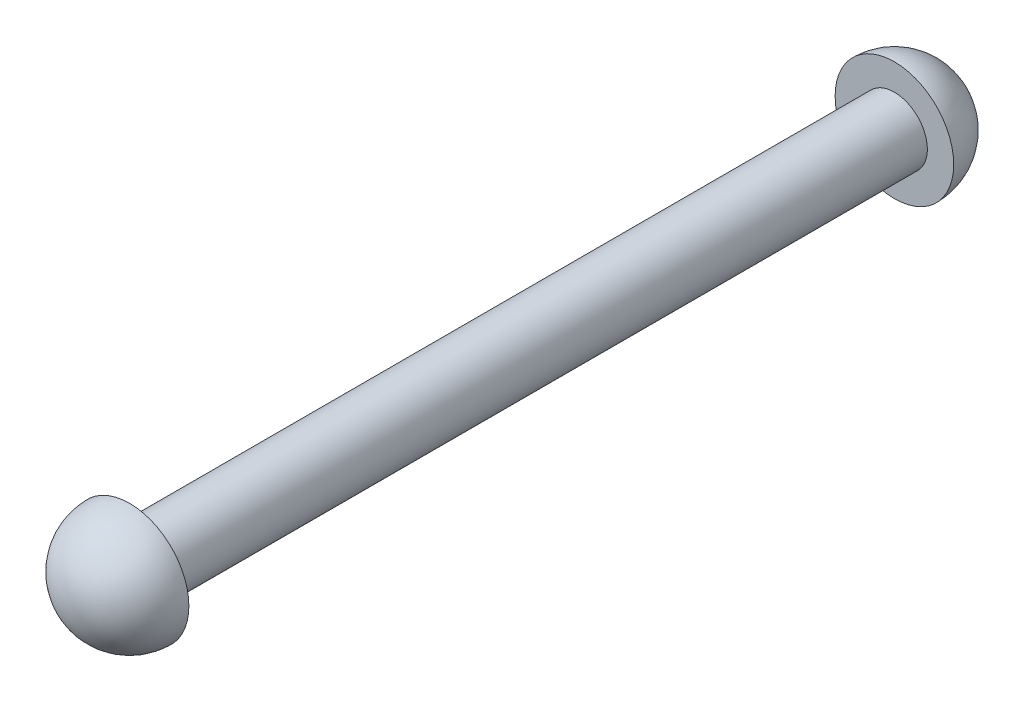
ISO-10303-21;
HEADER;
FILE_DESCRIPTION(('STEP AP214'),'2;1');
FILE_NAME('part.step','',(''),(''),'','','');
FILE_SCHEMA(('AUTOMOTIVE_DESIGN { 1 0 10303 214 1 1 1 1 }'));
ENDSEC;
DATA;
#1=APPLICATION_CONTEXT('core data for automotive mechanical design processes');
#2=APPLICATION_PROTOCOL_DEFINITION('international standard','automotive_design',2000,#1);
#3=PRODUCT_CONTEXT('',#1,'mechanical');
#4=PRODUCT('Part','Part','',(#3));
#5=PRODUCT_RELATED_PRODUCT_CATEGORY('part','',(#4));
#6=PRODUCT_DEFINITION_FORMATION('','',#4);
#7=PRODUCT_DEFINITION_CONTEXT('part definition',#1,'design');
#8=PRODUCT_DEFINITION('design','',#6,#7);
#9=PRODUCT_DEFINITION_SHAPE('','',#8);
#10=(LENGTH_UNIT() NAMED_UNIT(*) SI_UNIT(.MILLI.,.METRE.));
#11=(NAMED_UNIT(*) PLANE_ANGLE_UNIT() SI_UNIT($,.RADIAN.));
#12=(NAMED_UNIT(*) SI_UNIT($,.STERADIAN.) SOLID_ANGLE_UNIT());
#13=UNCERTAINTY_MEASURE_WITH_UNIT(LENGTH_MEASURE(1.E-05),#10,'distance_accuracy_value','');
#14=(GEOMETRIC_REPRESENTATION_CONTEXT(3) GLOBAL_UNCERTAINTY_ASSIGNED_CONTEXT((#13)) GLOBAL_UNIT_ASSIGNED_CONTEXT((#10,
#11,#12)) REPRESENTATION_CONTEXT('',''));
#15=CARTESIAN_POINT('',(0.,0.,0.));
#16=DIRECTION('',(0.,0.,1.));
#17=DIRECTION('',(1.,0.,0.));
#18=AXIS2_PLACEMENT_3D('',#15,#16,#17);
#19=CARTESIAN_POINT('',(0.,0.,42.5398199337912));
#20=DIRECTION('',(0.,0.,1.));
#21=DIRECTION('',(0.,-1.,0.));
#22=AXIS2_PLACEMENT_3D('',#19,#20,#21);
#23=CYLINDRICAL_SURFACE('',#22,3.175);
#24=CARTESIAN_POINT('',(0.,0.,-36.83));
#25=DIRECTION('',(0.,0.,1.));
#26=DIRECTION('',(0.,-1.,0.));
#27=AXIS2_PLACEMENT_3D('',#24,#25,#26);
#28=CIRCLE('',#27,3.175);
#29=CARTESIAN_POINT('',(0.,-3.175,-36.83));
#30=VERTEX_POINT('',#29);
#31=EDGE_CURVE('E62',#30,#30,#28,.T.);
#32=ORIENTED_EDGE('',*,*,#31,.T.);
#33=EDGE_LOOP('',(#32));
#34=FACE_BOUND('',#33,.T.);
#35=CARTESIAN_POINT('',(0.,0.,36.83));
#36=DIRECTION('',(0.,0.,1.));
#37=DIRECTION('',(0.,-1.,0.));
#38=AXIS2_PLACEMENT_3D('',#35,#36,#37);
#39=CIRCLE('',#38,3.175);
#40=CARTESIAN_POINT('',(0.,-3.175,36.83));
#41=VERTEX_POINT('',#40);
#42=EDGE_CURVE('E10',#41,#41,#39,.T.);
#43=ORIENTED_EDGE('',*,*,#42,.F.);
#44=EDGE_LOOP('',(#43));
#45=FACE_BOUND('',#44,.T.);
#46=ADVANCED_FACE('F45',(#34,#45),#23,.T.);
#47=CARTESIAN_POINT('',(0.,0.,36.83));
#48=DIRECTION('',(0.,0.,1.));
#49=DIRECTION('',(0.,-1.,0.));
#50=AXIS2_PLACEMENT_3D('',#47,#48,#49);
#51=PLANE('',#50);
#52=CARTESIAN_POINT('',(0.,0.,36.83));
#53=DIRECTION('',(0.,0.,1.));
#54=DIRECTION('',(0.,-1.,0.));
#55=AXIS2_PLACEMENT_3D('',#52,#53,#54);
#56=CIRCLE('',#55,5.70981993379119);
#57=CARTESIAN_POINT('',(0.,-5.70981993379119,36.83));
#58=VERTEX_POINT('',#57);
#59=EDGE_CURVE('E52',#58,#58,#56,.T.);
#60=ORIENTED_EDGE('',*,*,#59,.F.);
#61=EDGE_LOOP('',(#60));
#62=FACE_BOUND('',#61,.T.);
#63=ORIENTED_EDGE('',*,*,#42,.T.);
#64=EDGE_LOOP('',(#63));
#65=FACE_BOUND('',#64,.T.);
#66=ADVANCED_FACE('F83',(#62,#65),#51,.F.);
#67=CARTESIAN_POINT('',(0.,0.,36.83));
#68=DIRECTION('',(0.,0.,1.));
#69=DIRECTION('',(0.,1.,0.));
#70=AXIS2_PLACEMENT_3D('',#67,#68,#69);
#71=SPHERICAL_SURFACE('',#70,5.70981993379119);
#72=ORIENTED_EDGE('',*,*,#59,.T.);
#73=EDGE_LOOP('',(#72));
#74=FACE_BOUND('',#73,.T.);
#75=ADVANCED_FACE('F79',(#74),#71,.T.);
#76=CARTESIAN_POINT('',(0.,0.,-36.83));
#77=DIRECTION('',(0.,0.,1.));
#78=DIRECTION('',(0.,1.,0.));
#79=AXIS2_PLACEMENT_3D('',#76,#77,#78);
#80=SPHERICAL_SURFACE('',#79,5.70981993379119);
#81=CARTESIAN_POINT('',(0.,0.,-36.83));
#82=DIRECTION('',(0.,0.,1.));
#83=DIRECTION('',(0.,-1.,0.));
#84=AXIS2_PLACEMENT_3D('',#81,#82,#83);
#85=CIRCLE('',#84,5.70981993379119);
#86=CARTESIAN_POINT('',(0.,-5.70981993379119,-36.83));
#87=VERTEX_POINT('',#86);
#88=EDGE_CURVE('E57',#87,#87,#85,.T.);
#89=ORIENTED_EDGE('',*,*,#88,.F.);
#90=EDGE_LOOP('',(#89));
#91=FACE_BOUND('',#90,.T.);
#92=ADVANCED_FACE('F73',(#91),#80,.T.);
#93=CARTESIAN_POINT('',(0.,0.,-36.83));
#94=DIRECTION('',(0.,0.,1.));
#95=DIRECTION('',(0.,-1.,0.));
#96=AXIS2_PLACEMENT_3D('',#93,#94,#95);
#97=PLANE('',#96);
#98=ORIENTED_EDGE('',*,*,#88,.T.);
#99=EDGE_LOOP('',(#98));
#100=FACE_BOUND('',#99,.T.);
#101=ORIENTED_EDGE('',*,*,#31,.F.);
#102=EDGE_LOOP('',(#101));
#103=FACE_BOUND('',#102,.T.);
#104=ADVANCED_FACE('F71',(#100,#103),#97,.T.);
#105=CLOSED_SHELL('',(#46,#66,#75,#92,#104));
#106=MANIFOLD_SOLID_BREP('B2',#105);
#107=ADVANCED_BREP_SHAPE_REPRESENTATION('',(#18,#106),#14);
#108=SHAPE_DEFINITION_REPRESENTATION(#9,#107);
ENDSEC;
END-ISO-10303-21;
